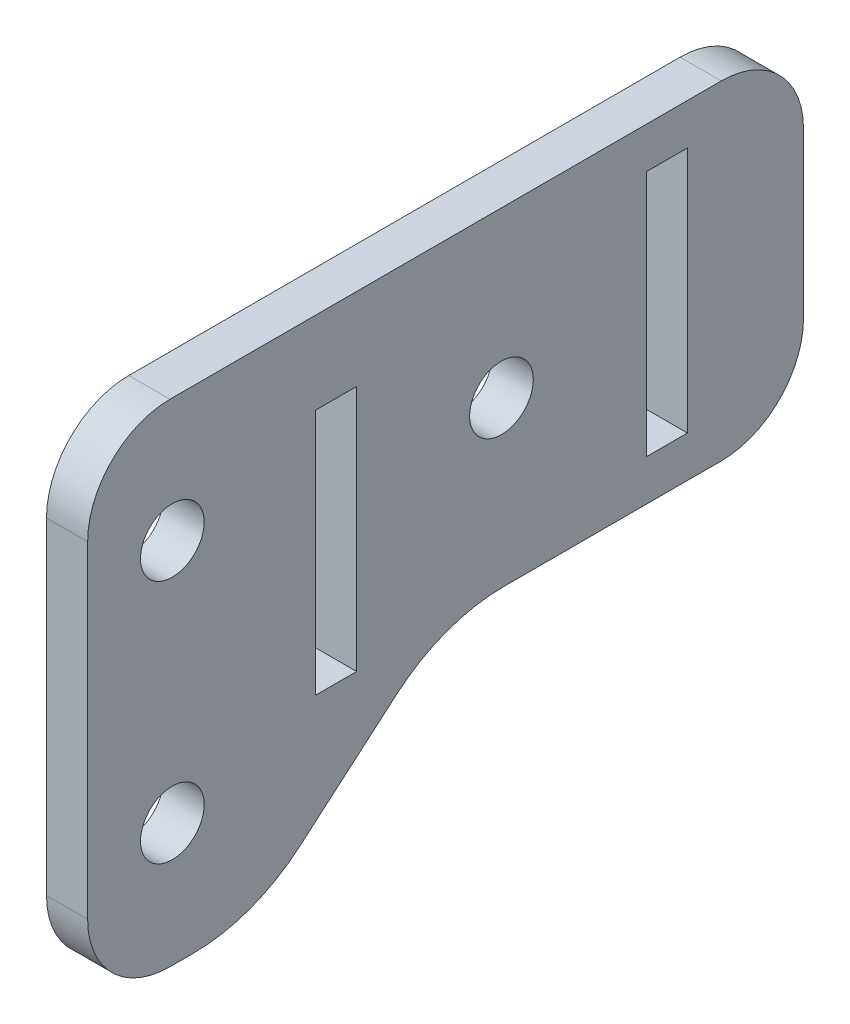
ISO-10303-21;
HEADER;
FILE_DESCRIPTION(('STEP AP214'),'2;1');
FILE_NAME('part.step','',(''),(''),'','','');
FILE_SCHEMA(('AUTOMOTIVE_DESIGN { 1 0 10303 214 1 1 1 1 }'));
ENDSEC;
DATA;
#1=APPLICATION_CONTEXT('core data for automotive mechanical design processes');
#2=APPLICATION_PROTOCOL_DEFINITION('international standard','automotive_design',2000,#1);
#3=PRODUCT_CONTEXT('',#1,'mechanical');
#4=PRODUCT('Part','Part','',(#3));
#5=PRODUCT_RELATED_PRODUCT_CATEGORY('part','',(#4));
#6=PRODUCT_DEFINITION_FORMATION('','',#4);
#7=PRODUCT_DEFINITION_CONTEXT('part definition',#1,'design');
#8=PRODUCT_DEFINITION('design','',#6,#7);
#9=PRODUCT_DEFINITION_SHAPE('','',#8);
#10=(LENGTH_UNIT() NAMED_UNIT(*) SI_UNIT(.MILLI.,.METRE.));
#11=(NAMED_UNIT(*) PLANE_ANGLE_UNIT() SI_UNIT($,.RADIAN.));
#12=(NAMED_UNIT(*) SI_UNIT($,.STERADIAN.) SOLID_ANGLE_UNIT());
#13=UNCERTAINTY_MEASURE_WITH_UNIT(LENGTH_MEASURE(1.E-05),#10,'distance_accuracy_value','');
#14=(GEOMETRIC_REPRESENTATION_CONTEXT(3) GLOBAL_UNCERTAINTY_ASSIGNED_CONTEXT((#13)) GLOBAL_UNIT_ASSIGNED_CONTEXT((#10,
#11,#12)) REPRESENTATION_CONTEXT('',''));
#15=CARTESIAN_POINT('',(0.,0.,0.));
#16=DIRECTION('',(0.,0.,1.));
#17=DIRECTION('',(1.,0.,0.));
#18=AXIS2_PLACEMENT_3D('',#15,#16,#17);
#19=CARTESIAN_POINT('',(3.175,17.2156788351446,31.9348602919418));
#20=DIRECTION('',(0.,0.,-1.));
#21=DIRECTION('',(0.,1.,0.));
#22=AXIS2_PLACEMENT_3D('',#19,#20,#21);
#23=PLANE('',#22);
#24=DIRECTION('',(0.,-1.,0.));
#25=VECTOR('',#24,1.);
#26=CARTESIAN_POINT('',(0.,17.2156788351446,31.9348602919418));
#27=LINE('',#26,#25);
#28=CARTESIAN_POINT('',(0.,10.8656788351446,31.9348602919418));
#29=VERTEX_POINT('',#28);
#30=CARTESIAN_POINT('',(0.,-14.3666811648554,31.9348602919418));
#31=VERTEX_POINT('',#30);
#32=EDGE_CURVE('E220',#29,#31,#27,.T.);
#33=ORIENTED_EDGE('',*,*,#32,.T.);
#34=DIRECTION('',(-1.,0.,0.));
#35=VECTOR('',#34,1.);
#36=CARTESIAN_POINT('',(3.175,-14.3666811648554,31.9348602919418));
#37=LINE('',#36,#35);
#38=CARTESIAN_POINT('',(3.175,-14.3666811648554,31.9348602919418));
#39=VERTEX_POINT('',#38);
#40=EDGE_CURVE('E11',#31,#39,#37,.F.);
#41=ORIENTED_EDGE('',*,*,#40,.T.);
#42=DIRECTION('',(0.,-1.,0.));
#43=VECTOR('',#42,1.);
#44=CARTESIAN_POINT('',(3.175,17.2156788351446,31.9348602919418));
#45=LINE('',#44,#43);
#46=CARTESIAN_POINT('',(3.175,10.8656788351446,31.9348602919418));
#47=VERTEX_POINT('',#46);
#48=EDGE_CURVE('E255',#47,#39,#45,.T.);
#49=ORIENTED_EDGE('',*,*,#48,.F.);
#50=DIRECTION('',(-1.,0.,0.));
#51=VECTOR('',#50,1.);
#52=CARTESIAN_POINT('',(3.175,10.8656788351446,31.9348602919418));
#53=LINE('',#52,#51);
#54=EDGE_CURVE('E45',#47,#29,#53,.T.);
#55=ORIENTED_EDGE('',*,*,#54,.T.);
#56=EDGE_LOOP('',(#33,#41,#49,#55));
#57=FACE_BOUND('',#56,.T.);
#58=ADVANCED_FACE('F37',(#57),#23,.F.);
#59=CARTESIAN_POINT('',(3.175,-20.7166811648554,23.8154632165909));
#60=DIRECTION('',(0.,1.,0.));
#61=DIRECTION('',(0.,0.,1.));
#62=AXIS2_PLACEMENT_3D('',#59,#60,#61);
#63=PLANE('',#62);
#64=DIRECTION('',(0.,0.,-1.));
#65=VECTOR('',#64,1.);
#66=CARTESIAN_POINT('',(3.175,-20.7166811648554,23.8154632165909));
#67=LINE('',#66,#65);
#68=CARTESIAN_POINT('',(3.175,-20.7166811648554,25.5848602919418));
#69=VERTEX_POINT('',#68);
#70=CARTESIAN_POINT('',(3.175,-20.7166811648554,23.8154632165909));
#71=VERTEX_POINT('',#70);
#72=EDGE_CURVE('E257',#69,#71,#67,.T.);
#73=ORIENTED_EDGE('',*,*,#72,.F.);
#74=DIRECTION('',(-1.,0.,0.));
#75=VECTOR('',#74,1.);
#76=CARTESIAN_POINT('',(3.175,-20.7166811648554,25.5848602919418));
#77=LINE('',#76,#75);
#78=CARTESIAN_POINT('',(0.,-20.7166811648554,25.5848602919418));
#79=VERTEX_POINT('',#78);
#80=EDGE_CURVE('E329',#69,#79,#77,.T.);
#81=ORIENTED_EDGE('',*,*,#80,.T.);
#82=DIRECTION('',(0.,0.,-1.));
#83=VECTOR('',#82,1.);
#84=CARTESIAN_POINT('',(0.,-20.7166811648554,23.8154632165909));
#85=LINE('',#84,#83);
#86=CARTESIAN_POINT('',(0.,-20.7166811648554,23.8154632165909));
#87=VERTEX_POINT('',#86);
#88=EDGE_CURVE('E277',#79,#87,#85,.T.);
#89=ORIENTED_EDGE('',*,*,#88,.T.);
#90=DIRECTION('',(-1.,0.,0.));
#91=VECTOR('',#90,1.);
#92=CARTESIAN_POINT('',(3.175,-20.7166811648554,23.8154632165909));
#93=LINE('',#92,#91);
#94=EDGE_CURVE('E300',#71,#87,#93,.T.);
#95=ORIENTED_EDGE('',*,*,#94,.F.);
#96=EDGE_LOOP('',(#73,#81,#89,#95));
#97=FACE_BOUND('',#96,.T.);
#98=ADVANCED_FACE('F348',(#97),#63,.F.);
#99=CARTESIAN_POINT('',(3.175,-8.01668116485543,23.8154632165909));
#100=DIRECTION('',(-1.,0.,0.));
#101=DIRECTION('',(0.,0.,1.));
#102=AXIS2_PLACEMENT_3D('',#99,#100,#101);
#103=CYLINDRICAL_SURFACE('',#102,12.7);
#104=CARTESIAN_POINT('',(0.,-8.01668116485543,23.8154632165909));
#105=DIRECTION('',(1.,0.,0.));
#106=DIRECTION('',(0.,0.,-1.));
#107=AXIS2_PLACEMENT_3D('',#104,#105,#106);
#108=CIRCLE('',#107,12.7);
#109=CARTESIAN_POINT('',(0.,-17.6547424695242,15.5451685248978));
#110=VERTEX_POINT('',#109);
#111=EDGE_CURVE('E279',#87,#110,#108,.T.);
#112=ORIENTED_EDGE('',*,*,#111,.T.);
#113=DIRECTION('',(-1.,0.,0.));
#114=VECTOR('',#113,1.);
#115=CARTESIAN_POINT('',(3.175,-17.6547424695242,15.5451685248978));
#116=LINE('',#115,#114);
#117=CARTESIAN_POINT('',(3.175,-17.6547424695242,15.5451685248978));
#118=VERTEX_POINT('',#117);
#119=EDGE_CURVE('E297',#118,#110,#116,.T.);
#120=ORIENTED_EDGE('',*,*,#119,.F.);
#121=CARTESIAN_POINT('',(3.175,-8.01668116485543,23.8154632165909));
#122=DIRECTION('',(1.,0.,0.));
#123=DIRECTION('',(0.,0.,-1.));
#124=AXIS2_PLACEMENT_3D('',#121,#122,#123);
#125=CIRCLE('',#124,12.7);
#126=EDGE_CURVE('E260',#71,#118,#125,.T.);
#127=ORIENTED_EDGE('',*,*,#126,.F.);
#128=ORIENTED_EDGE('',*,*,#94,.T.);
#129=EDGE_LOOP('',(#112,#120,#127,#128));
#130=FACE_BOUND('',#129,.T.);
#131=ADVANCED_FACE('F355',(#130),#103,.T.);
#132=CARTESIAN_POINT('',(3.175,-11.2462598601867,8.07683147510241));
#133=DIRECTION('',(0.,0.758902464934545,0.651204306432529));
#134=DIRECTION('',(0.,-0.651204306432529,0.758902464934545));
#135=AXIS2_PLACEMENT_3D('',#132,#133,#134);
#136=PLANE('',#135);
#137=DIRECTION('',(0.,0.651204306432529,-0.758902464934545));
#138=VECTOR('',#137,1.);
#139=CARTESIAN_POINT('',(0.,-11.2462598601867,8.07683147510241));
#140=LINE('',#139,#138);
#141=CARTESIAN_POINT('',(0.,-11.2462598601867,8.07683147510241));
#142=VERTEX_POINT('',#141);
#143=EDGE_CURVE('E281',#110,#142,#140,.T.);
#144=ORIENTED_EDGE('',*,*,#143,.T.);
#145=DIRECTION('',(-1.,0.,0.));
#146=VECTOR('',#145,1.);
#147=CARTESIAN_POINT('',(3.175,-11.2462598601867,8.07683147510241));
#148=LINE('',#147,#146);
#149=CARTESIAN_POINT('',(3.175,-11.2462598601867,8.07683147510241));
#150=VERTEX_POINT('',#149);
#151=EDGE_CURVE('E294',#150,#142,#148,.T.);
#152=ORIENTED_EDGE('',*,*,#151,.F.);
#153=DIRECTION('',(0.,0.651204306432529,-0.758902464934545));
#154=VECTOR('',#153,1.);
#155=CARTESIAN_POINT('',(3.175,-11.2462598601867,8.07683147510241));
#156=LINE('',#155,#154);
#157=EDGE_CURVE('E262',#118,#150,#156,.T.);
#158=ORIENTED_EDGE('',*,*,#157,.F.);
#159=ORIENTED_EDGE('',*,*,#119,.T.);
#160=EDGE_LOOP('',(#144,#152,#158,#159));
#161=FACE_BOUND('',#160,.T.);
#162=ADVANCED_FACE('F358',(#161),#136,.F.);
#163=CARTESIAN_POINT('',(3.175,-20.8843211648554,-0.193463216590709));
#164=DIRECTION('',(-1.,0.,0.));
#165=DIRECTION('',(0.,0.,1.));
#166=AXIS2_PLACEMENT_3D('',#163,#164,#165);
#167=CYLINDRICAL_SURFACE('',#166,12.7);
#168=CARTESIAN_POINT('',(0.,-20.8843211648554,-0.193463216590709));
#169=DIRECTION('',(-1.,0.,0.));
#170=DIRECTION('',(0.,0.,-1.));
#171=AXIS2_PLACEMENT_3D('',#168,#169,#170);
#172=CIRCLE('',#171,12.7);
#173=CARTESIAN_POINT('',(0.,-8.18432116485543,-0.193463216590736));
#174=VERTEX_POINT('',#173);
#175=EDGE_CURVE('E283',#142,#174,#172,.T.);
#176=ORIENTED_EDGE('',*,*,#175,.T.);
#177=DIRECTION('',(-1.,0.,0.));
#178=VECTOR('',#177,1.);
#179=CARTESIAN_POINT('',(3.175,-8.18432116485543,-0.193463216590736));
#180=LINE('',#179,#178);
#181=CARTESIAN_POINT('',(3.175,-8.18432116485543,-0.193463216590736));
#182=VERTEX_POINT('',#181);
#183=EDGE_CURVE('E274',#182,#174,#180,.T.);
#184=ORIENTED_EDGE('',*,*,#183,.F.);
#185=CARTESIAN_POINT('',(3.175,-20.8843211648554,-0.193463216590709));
#186=DIRECTION('',(-1.,0.,0.));
#187=DIRECTION('',(0.,0.,-1.));
#188=AXIS2_PLACEMENT_3D('',#185,#186,#187);
#189=CIRCLE('',#188,12.7);
#190=EDGE_CURVE('E264',#150,#182,#189,.T.);
#191=ORIENTED_EDGE('',*,*,#190,.F.);
#192=ORIENTED_EDGE('',*,*,#151,.T.);
#193=EDGE_LOOP('',(#176,#184,#191,#192));
#194=FACE_BOUND('',#193,.T.);
#195=ADVANCED_FACE('F363',(#194),#167,.F.);
#196=CARTESIAN_POINT('',(3.175,-8.18432116485543,-23.3101397080582));
#197=DIRECTION('',(0.,1.,0.));
#198=DIRECTION('',(0.,0.,1.));
#199=AXIS2_PLACEMENT_3D('',#196,#197,#198);
#200=PLANE('',#199);
#201=DIRECTION('',(0.,0.,-1.));
#202=VECTOR('',#201,1.);
#203=CARTESIAN_POINT('',(0.,-8.18432116485543,-23.3101397080582));
#204=LINE('',#203,#202);
#205=CARTESIAN_POINT('',(0.,-8.18432116485543,-16.9601397080582));
#206=VERTEX_POINT('',#205);
#207=EDGE_CURVE('E285',#174,#206,#204,.T.);
#208=ORIENTED_EDGE('',*,*,#207,.T.);
#209=DIRECTION('',(-1.,0.,0.));
#210=VECTOR('',#209,1.);
#211=CARTESIAN_POINT('',(3.175,-8.18432116485543,-16.9601397080582));
#212=LINE('',#211,#210);
#213=CARTESIAN_POINT('',(3.175,-8.18432116485543,-16.9601397080582));
#214=VERTEX_POINT('',#213);
#215=EDGE_CURVE('E52',#206,#214,#212,.F.);
#216=ORIENTED_EDGE('',*,*,#215,.T.);
#217=DIRECTION('',(0.,0.,-1.));
#218=VECTOR('',#217,1.);
#219=CARTESIAN_POINT('',(3.175,-8.18432116485543,-23.3101397080582));
#220=LINE('',#219,#218);
#221=EDGE_CURVE('E266',#182,#214,#220,.T.);
#222=ORIENTED_EDGE('',*,*,#221,.F.);
#223=ORIENTED_EDGE('',*,*,#183,.T.);
#224=EDGE_LOOP('',(#208,#216,#222,#223));
#225=FACE_BOUND('',#224,.T.);
#226=ADVANCED_FACE('F544',(#225),#200,.F.);
#227=CARTESIAN_POINT('',(3.175,-8.18432116485543,-23.3101397080582));
#228=DIRECTION('',(0.,0.,1.));
#229=DIRECTION('',(1.,0.,0.));
#230=AXIS2_PLACEMENT_3D('',#227,#228,#229);
#231=PLANE('',#230);
#232=DIRECTION('',(0.,1.,0.));
#233=VECTOR('',#232,1.);
#234=CARTESIAN_POINT('',(0.,-8.18432116485543,-23.3101397080582));
#235=LINE('',#234,#233);
#236=CARTESIAN_POINT('',(0.,-1.83432116485543,-23.3101397080582));
#237=VERTEX_POINT('',#236);
#238=CARTESIAN_POINT('',(0.,10.8656788351446,-23.3101397080582));
#239=VERTEX_POINT('',#238);
#240=EDGE_CURVE('E287',#237,#239,#235,.T.);
#241=ORIENTED_EDGE('',*,*,#240,.T.);
#242=DIRECTION('',(-1.,0.,0.));
#243=VECTOR('',#242,1.);
#244=CARTESIAN_POINT('',(3.175,10.8656788351446,-23.3101397080582));
#245=LINE('',#244,#243);
#246=CARTESIAN_POINT('',(3.175,10.8656788351446,-23.3101397080582));
#247=VERTEX_POINT('',#246);
#248=EDGE_CURVE('E319',#239,#247,#245,.F.);
#249=ORIENTED_EDGE('',*,*,#248,.T.);
#250=DIRECTION('',(0.,1.,0.));
#251=VECTOR('',#250,1.);
#252=CARTESIAN_POINT('',(3.175,-8.18432116485543,-23.3101397080582));
#253=LINE('',#252,#251);
#254=CARTESIAN_POINT('',(3.175,-1.83432116485543,-23.3101397080582));
#255=VERTEX_POINT('',#254);
#256=EDGE_CURVE('E268',#255,#247,#253,.T.);
#257=ORIENTED_EDGE('',*,*,#256,.F.);
#258=DIRECTION('',(-1.,0.,0.));
#259=VECTOR('',#258,1.);
#260=CARTESIAN_POINT('',(3.175,-1.83432116485543,-23.3101397080582));
#261=LINE('',#260,#259);
#262=EDGE_CURVE('E316',#255,#237,#261,.T.);
#263=ORIENTED_EDGE('',*,*,#262,.T.);
#264=EDGE_LOOP('',(#241,#249,#257,#263));
#265=FACE_BOUND('',#264,.T.);
#266=ADVANCED_FACE('F371',(#265),#231,.F.);
#267=CARTESIAN_POINT('',(3.175,17.2156788351446,31.9348602919418));
#268=DIRECTION('',(0.,-1.,0.));
#269=DIRECTION('',(0.,0.,-1.));
#270=AXIS2_PLACEMENT_3D('',#267,#268,#269);
#271=PLANE('',#270);
#272=DIRECTION('',(0.,0.,1.));
#273=VECTOR('',#272,1.);
#274=CARTESIAN_POINT('',(3.175,17.2156788351446,31.9348602919418));
#275=LINE('',#274,#273);
#276=CARTESIAN_POINT('',(3.175,17.2156788351446,-16.9601397080582));
#277=VERTEX_POINT('',#276);
#278=CARTESIAN_POINT('',(3.175,17.2156788351446,25.5848602919418));
#279=VERTEX_POINT('',#278);
#280=EDGE_CURVE('E271',#277,#279,#275,.T.);
#281=ORIENTED_EDGE('',*,*,#280,.F.);
#282=DIRECTION('',(-1.,0.,0.));
#283=VECTOR('',#282,1.);
#284=CARTESIAN_POINT('',(3.175,17.2156788351446,-16.9601397080582));
#285=LINE('',#284,#283);
#286=CARTESIAN_POINT('',(0.,17.2156788351446,-16.9601397080582));
#287=VERTEX_POINT('',#286);
#288=EDGE_CURVE('E305',#277,#287,#285,.T.);
#289=ORIENTED_EDGE('',*,*,#288,.T.);
#290=DIRECTION('',(0.,0.,1.));
#291=VECTOR('',#290,1.);
#292=CARTESIAN_POINT('',(0.,17.2156788351446,31.9348602919418));
#293=LINE('',#292,#291);
#294=CARTESIAN_POINT('',(0.,17.2156788351446,25.5848602919418));
#295=VERTEX_POINT('',#294);
#296=EDGE_CURVE('E258',#287,#295,#293,.T.);
#297=ORIENTED_EDGE('',*,*,#296,.T.);
#298=DIRECTION('',(-1.,0.,0.));
#299=VECTOR('',#298,1.);
#300=CARTESIAN_POINT('',(3.175,17.2156788351446,25.5848602919418));
#301=LINE('',#300,#299);
#302=EDGE_CURVE('E303',#295,#279,#301,.F.);
#303=ORIENTED_EDGE('',*,*,#302,.T.);
#304=EDGE_LOOP('',(#281,#289,#297,#303));
#305=FACE_BOUND('',#304,.T.);
#306=ADVANCED_FACE('F380',(#305),#271,.F.);
#307=CARTESIAN_POINT('',(3.175,-8.01668116485543,23.8154632165909));
#308=DIRECTION('',(1.,0.,0.));
#309=DIRECTION('',(0.,0.,-1.));
#310=AXIS2_PLACEMENT_3D('',#307,#308,#309);
#311=PLANE('',#310);
#312=CARTESIAN_POINT('',(3.175,7.69067883514458,25.4));
#313=DIRECTION('',(1.,0.,0.));
#314=DIRECTION('',(0.,0.,-1.));
#315=AXIS2_PLACEMENT_3D('',#312,#313,#314);
#316=CIRCLE('',#315,2.45744999999999);
#317=CARTESIAN_POINT('',(3.175,7.69067883514458,22.94255));
#318=VERTEX_POINT('',#317);
#319=EDGE_CURVE('E604',#318,#318,#316,.T.);
#320=ORIENTED_EDGE('',*,*,#319,.F.);
#321=EDGE_LOOP('',(#320));
#322=FACE_BOUND('',#321,.T.);
#323=CARTESIAN_POINT('',(3.175,-11.1916811648554,25.4));
#324=DIRECTION('',(1.,0.,0.));
#325=DIRECTION('',(0.,0.,-1.));
#326=AXIS2_PLACEMENT_3D('',#323,#324,#325);
#327=CIRCLE('',#326,2.45744999999999);
#328=CARTESIAN_POINT('',(3.175,-11.1916811648554,22.94255));
#329=VERTEX_POINT('',#328);
#330=EDGE_CURVE('E608',#329,#329,#327,.T.);
#331=ORIENTED_EDGE('',*,*,#330,.F.);
#332=EDGE_LOOP('',(#331));
#333=FACE_BOUND('',#332,.T.);
#334=CARTESIAN_POINT('',(3.175,4.51567883514458,0.));
#335=DIRECTION('',(1.,0.,0.));
#336=DIRECTION('',(0.,0.,-1.));
#337=AXIS2_PLACEMENT_3D('',#334,#335,#336);
#338=CIRCLE('',#337,2.45744999999999);
#339=CARTESIAN_POINT('',(3.175,4.51567883514458,-2.45744999999999));
#340=VERTEX_POINT('',#339);
#341=EDGE_CURVE('E207',#340,#340,#338,.T.);
#342=ORIENTED_EDGE('',*,*,#341,.F.);
#343=EDGE_LOOP('',(#342));
#344=FACE_BOUND('',#343,.T.);
#345=DIRECTION('',(0.,1.,0.));
#346=VECTOR('',#345,1.);
#347=CARTESIAN_POINT('',(3.175,14.0406788351446,-11.176));
#348=LINE('',#347,#346);
#349=CARTESIAN_POINT('',(3.175,-5.00932116485543,-11.176));
#350=VERTEX_POINT('',#349);
#351=CARTESIAN_POINT('',(3.175,14.0406788351446,-11.176));
#352=VERTEX_POINT('',#351);
#353=EDGE_CURVE('E180',#350,#352,#348,.T.);
#354=ORIENTED_EDGE('',*,*,#353,.T.);
#355=DIRECTION('',(0.,0.,-1.));
#356=VECTOR('',#355,1.);
#357=CARTESIAN_POINT('',(3.175,14.0406788351446,-11.176));
#358=LINE('',#357,#356);
#359=CARTESIAN_POINT('',(3.175,14.0406788351446,-14.351));
#360=VERTEX_POINT('',#359);
#361=EDGE_CURVE('E192',#352,#360,#358,.T.);
#362=ORIENTED_EDGE('',*,*,#361,.T.);
#363=DIRECTION('',(0.,-1.,0.));
#364=VECTOR('',#363,1.);
#365=CARTESIAN_POINT('',(3.175,-5.00932116485543,-14.351));
#366=LINE('',#365,#364);
#367=CARTESIAN_POINT('',(3.175,-5.00932116485543,-14.351));
#368=VERTEX_POINT('',#367);
#369=EDGE_CURVE('E196',#360,#368,#366,.T.);
#370=ORIENTED_EDGE('',*,*,#369,.T.);
#371=DIRECTION('',(0.,0.,1.));
#372=VECTOR('',#371,1.);
#373=CARTESIAN_POINT('',(3.175,-5.00932116485543,-11.176));
#374=LINE('',#373,#372);
#375=EDGE_CURVE('E188',#368,#350,#374,.T.);
#376=ORIENTED_EDGE('',*,*,#375,.T.);
#377=EDGE_LOOP('',(#354,#362,#370,#376));
#378=FACE_BOUND('',#377,.T.);
#379=DIRECTION('',(0.,1.,0.));
#380=VECTOR('',#379,1.);
#381=CARTESIAN_POINT('',(3.175,-8.18432116485535,14.351));
#382=LINE('',#381,#380);
#383=CARTESIAN_POINT('',(3.175,-8.18432116485535,14.351));
#384=VERTEX_POINT('',#383);
#385=CARTESIAN_POINT('',(3.175,10.8656788351446,14.351));
#386=VERTEX_POINT('',#385);
#387=EDGE_CURVE('E224',#384,#386,#382,.T.);
#388=ORIENTED_EDGE('',*,*,#387,.T.);
#389=DIRECTION('',(0.,0.,-1.));
#390=VECTOR('',#389,1.);
#391=CARTESIAN_POINT('',(3.175,10.8656788351446,14.351));
#392=LINE('',#391,#390);
#393=CARTESIAN_POINT('',(3.175,10.8656788351446,11.176));
#394=VERTEX_POINT('',#393);
#395=EDGE_CURVE('E227',#386,#394,#392,.T.);
#396=ORIENTED_EDGE('',*,*,#395,.T.);
#397=DIRECTION('',(0.,-1.,0.));
#398=VECTOR('',#397,1.);
#399=CARTESIAN_POINT('',(3.175,10.8656788351446,11.176));
#400=LINE('',#399,#398);
#401=CARTESIAN_POINT('',(3.175,-8.18432116485535,11.176));
#402=VERTEX_POINT('',#401);
#403=EDGE_CURVE('E231',#394,#402,#400,.T.);
#404=ORIENTED_EDGE('',*,*,#403,.T.);
#405=DIRECTION('',(0.,0.,1.));
#406=VECTOR('',#405,1.);
#407=CARTESIAN_POINT('',(3.175,-8.18432116485535,11.176));
#408=LINE('',#407,#406);
#409=EDGE_CURVE('E234',#402,#384,#408,.T.);
#410=ORIENTED_EDGE('',*,*,#409,.T.);
#411=EDGE_LOOP('',(#388,#396,#404,#410));
#412=FACE_BOUND('',#411,.T.);
#413=ORIENTED_EDGE('',*,*,#256,.T.);
#414=CARTESIAN_POINT('',(3.175,10.8656788351446,-16.9601397080582));
#415=DIRECTION('',(1.,0.,0.));
#416=DIRECTION('',(0.,0.,-1.));
#417=AXIS2_PLACEMENT_3D('',#414,#415,#416);
#418=CIRCLE('',#417,6.35);
#419=EDGE_CURVE('E326',#247,#277,#418,.T.);
#420=ORIENTED_EDGE('',*,*,#419,.T.);
#421=ORIENTED_EDGE('',*,*,#280,.T.);
#422=CARTESIAN_POINT('',(3.175,10.8656788351446,25.5848602919418));
#423=DIRECTION('',(1.,0.,0.));
#424=DIRECTION('',(0.,0.,-1.));
#425=AXIS2_PLACEMENT_3D('',#422,#423,#424);
#426=CIRCLE('',#425,6.35);
#427=EDGE_CURVE('E321',#279,#47,#426,.T.);
#428=ORIENTED_EDGE('',*,*,#427,.T.);
#429=ORIENTED_EDGE('',*,*,#48,.T.);
#430=CARTESIAN_POINT('',(3.175,-14.3666811648554,25.5848602919418));
#431=DIRECTION('',(1.,0.,0.));
#432=DIRECTION('',(0.,0.,-1.));
#433=AXIS2_PLACEMENT_3D('',#430,#431,#432);
#434=CIRCLE('',#433,6.35);
#435=EDGE_CURVE('E60',#39,#69,#434,.T.);
#436=ORIENTED_EDGE('',*,*,#435,.T.);
#437=ORIENTED_EDGE('',*,*,#72,.T.);
#438=ORIENTED_EDGE('',*,*,#126,.T.);
#439=ORIENTED_EDGE('',*,*,#157,.T.);
#440=ORIENTED_EDGE('',*,*,#190,.T.);
#441=ORIENTED_EDGE('',*,*,#221,.T.);
#442=CARTESIAN_POINT('',(3.175,-1.83432116485543,-16.9601397080582));
#443=DIRECTION('',(1.,0.,0.));
#444=DIRECTION('',(0.,0.,-1.));
#445=AXIS2_PLACEMENT_3D('',#442,#443,#444);
#446=CIRCLE('',#445,6.35);
#447=EDGE_CURVE('E324',#214,#255,#446,.T.);
#448=ORIENTED_EDGE('',*,*,#447,.T.);
#449=EDGE_LOOP('',(#413,#420,#421,#428,#429,#436,#437,#438,#439,#440,#441,#448));
#450=FACE_BOUND('',#449,.T.);
#451=ADVANCED_FACE('F198',(#322,#333,#344,#378,#412,#450),#311,.T.);
#452=CARTESIAN_POINT('',(0.,-8.01668116485543,23.8154632165909));
#453=DIRECTION('',(1.,0.,0.));
#454=DIRECTION('',(0.,0.,-1.));
#455=AXIS2_PLACEMENT_3D('',#452,#453,#454);
#456=PLANE('',#455);
#457=CARTESIAN_POINT('',(0.,7.69067883514458,25.4));
#458=DIRECTION('',(-1.,0.,0.));
#459=DIRECTION('',(0.,0.,1.));
#460=AXIS2_PLACEMENT_3D('',#457,#458,#459);
#461=CIRCLE('',#460,2.45744999999999);
#462=CARTESIAN_POINT('',(0.,7.69067883514458,27.85745));
#463=VERTEX_POINT('',#462);
#464=EDGE_CURVE('E621',#463,#463,#461,.T.);
#465=ORIENTED_EDGE('',*,*,#464,.F.);
#466=EDGE_LOOP('',(#465));
#467=FACE_BOUND('',#466,.T.);
#468=CARTESIAN_POINT('',(0.,-11.1916811648554,25.4));
#469=DIRECTION('',(-1.,0.,0.));
#470=DIRECTION('',(0.,0.,1.));
#471=AXIS2_PLACEMENT_3D('',#468,#469,#470);
#472=CIRCLE('',#471,2.45744999999999);
#473=CARTESIAN_POINT('',(0.,-11.1916811648554,27.85745));
#474=VERTEX_POINT('',#473);
#475=EDGE_CURVE('E615',#474,#474,#472,.T.);
#476=ORIENTED_EDGE('',*,*,#475,.F.);
#477=EDGE_LOOP('',(#476));
#478=FACE_BOUND('',#477,.T.);
#479=CARTESIAN_POINT('',(0.,4.51567883514458,0.));
#480=DIRECTION('',(-1.,0.,0.));
#481=DIRECTION('',(0.,0.,1.));
#482=AXIS2_PLACEMENT_3D('',#479,#480,#481);
#483=CIRCLE('',#482,2.45744999999999);
#484=CARTESIAN_POINT('',(0.,4.51567883514458,2.45744999999999));
#485=VERTEX_POINT('',#484);
#486=EDGE_CURVE('E611',#485,#485,#483,.T.);
#487=ORIENTED_EDGE('',*,*,#486,.F.);
#488=EDGE_LOOP('',(#487));
#489=FACE_BOUND('',#488,.T.);
#490=DIRECTION('',(0.,0.,-1.));
#491=VECTOR('',#490,1.);
#492=CARTESIAN_POINT('',(0.,14.0406788351446,-11.176));
#493=LINE('',#492,#491);
#494=CARTESIAN_POINT('',(0.,14.0406788351446,-11.176));
#495=VERTEX_POINT('',#494);
#496=CARTESIAN_POINT('',(0.,14.0406788351446,-14.351));
#497=VERTEX_POINT('',#496);
#498=EDGE_CURVE('E213',#495,#497,#493,.T.);
#499=ORIENTED_EDGE('',*,*,#498,.F.);
#500=DIRECTION('',(0.,1.,0.));
#501=VECTOR('',#500,1.);
#502=CARTESIAN_POINT('',(0.,14.0406788351446,-11.176));
#503=LINE('',#502,#501);
#504=CARTESIAN_POINT('',(0.,-5.00932116485543,-11.176));
#505=VERTEX_POINT('',#504);
#506=EDGE_CURVE('E183',#505,#495,#503,.T.);
#507=ORIENTED_EDGE('',*,*,#506,.F.);
#508=DIRECTION('',(0.,0.,1.));
#509=VECTOR('',#508,1.);
#510=CARTESIAN_POINT('',(0.,-5.00932116485543,-11.176));
#511=LINE('',#510,#509);
#512=CARTESIAN_POINT('',(0.,-5.00932116485543,-14.351));
#513=VERTEX_POINT('',#512);
#514=EDGE_CURVE('E201',#513,#505,#511,.T.);
#515=ORIENTED_EDGE('',*,*,#514,.F.);
#516=DIRECTION('',(0.,-1.,0.));
#517=VECTOR('',#516,1.);
#518=CARTESIAN_POINT('',(0.,-5.00932116485543,-14.351));
#519=LINE('',#518,#517);
#520=EDGE_CURVE('E204',#497,#513,#519,.T.);
#521=ORIENTED_EDGE('',*,*,#520,.F.);
#522=EDGE_LOOP('',(#499,#507,#515,#521));
#523=FACE_BOUND('',#522,.T.);
#524=DIRECTION('',(0.,0.,-1.));
#525=VECTOR('',#524,1.);
#526=CARTESIAN_POINT('',(0.,10.8656788351446,14.351));
#527=LINE('',#526,#525);
#528=CARTESIAN_POINT('',(0.,10.8656788351446,14.351));
#529=VERTEX_POINT('',#528);
#530=CARTESIAN_POINT('',(0.,10.8656788351446,11.176));
#531=VERTEX_POINT('',#530);
#532=EDGE_CURVE('E240',#529,#531,#527,.T.);
#533=ORIENTED_EDGE('',*,*,#532,.F.);
#534=DIRECTION('',(0.,1.,0.));
#535=VECTOR('',#534,1.);
#536=CARTESIAN_POINT('',(0.,-8.18432116485535,14.351));
#537=LINE('',#536,#535);
#538=CARTESIAN_POINT('',(0.,-8.18432116485535,14.351));
#539=VERTEX_POINT('',#538);
#540=EDGE_CURVE('E238',#539,#529,#537,.T.);
#541=ORIENTED_EDGE('',*,*,#540,.F.);
#542=DIRECTION('',(0.,0.,1.));
#543=VECTOR('',#542,1.);
#544=CARTESIAN_POINT('',(0.,-8.18432116485535,11.176));
#545=LINE('',#544,#543);
#546=CARTESIAN_POINT('',(0.,-8.18432116485535,11.176));
#547=VERTEX_POINT('',#546);
#548=EDGE_CURVE('E228',#547,#539,#545,.T.);
#549=ORIENTED_EDGE('',*,*,#548,.F.);
#550=DIRECTION('',(0.,-1.,0.));
#551=VECTOR('',#550,1.);
#552=CARTESIAN_POINT('',(0.,10.8656788351446,11.176));
#553=LINE('',#552,#551);
#554=EDGE_CURVE('E243',#531,#547,#553,.T.);
#555=ORIENTED_EDGE('',*,*,#554,.F.);
#556=EDGE_LOOP('',(#533,#541,#549,#555));
#557=FACE_BOUND('',#556,.T.);
#558=ORIENTED_EDGE('',*,*,#296,.F.);
#559=CARTESIAN_POINT('',(0.,10.8656788351446,-16.9601397080582));
#560=DIRECTION('',(1.,0.,0.));
#561=DIRECTION('',(0.,0.,-1.));
#562=AXIS2_PLACEMENT_3D('',#559,#560,#561);
#563=CIRCLE('',#562,6.35);
#564=EDGE_CURVE('E314',#287,#239,#563,.F.);
#565=ORIENTED_EDGE('',*,*,#564,.T.);
#566=ORIENTED_EDGE('',*,*,#240,.F.);
#567=CARTESIAN_POINT('',(0.,-1.83432116485543,-16.9601397080582));
#568=DIRECTION('',(1.,0.,0.));
#569=DIRECTION('',(0.,0.,-1.));
#570=AXIS2_PLACEMENT_3D('',#567,#568,#569);
#571=CIRCLE('',#570,6.35);
#572=EDGE_CURVE('E312',#237,#206,#571,.F.);
#573=ORIENTED_EDGE('',*,*,#572,.T.);
#574=ORIENTED_EDGE('',*,*,#207,.F.);
#575=ORIENTED_EDGE('',*,*,#175,.F.);
#576=ORIENTED_EDGE('',*,*,#143,.F.);
#577=ORIENTED_EDGE('',*,*,#111,.F.);
#578=ORIENTED_EDGE('',*,*,#88,.F.);
#579=CARTESIAN_POINT('',(0.,-14.3666811648554,25.5848602919418));
#580=DIRECTION('',(1.,0.,0.));
#581=DIRECTION('',(0.,0.,-1.));
#582=AXIS2_PLACEMENT_3D('',#579,#580,#581);
#583=CIRCLE('',#582,6.35);
#584=EDGE_CURVE('E310',#79,#31,#583,.F.);
#585=ORIENTED_EDGE('',*,*,#584,.T.);
#586=ORIENTED_EDGE('',*,*,#32,.F.);
#587=CARTESIAN_POINT('',(0.,10.8656788351446,25.5848602919418));
#588=DIRECTION('',(1.,0.,0.));
#589=DIRECTION('',(0.,0.,-1.));
#590=AXIS2_PLACEMENT_3D('',#587,#588,#589);
#591=CIRCLE('',#590,6.35);
#592=EDGE_CURVE('E308',#29,#295,#591,.F.);
#593=ORIENTED_EDGE('',*,*,#592,.T.);
#594=EDGE_LOOP('',(#558,#565,#566,#573,#574,#575,#576,#577,#578,#585,#586,#593));
#595=FACE_BOUND('',#594,.T.);
#596=ADVANCED_FACE('F341',(#467,#478,#489,#523,#557,#595),#456,.F.);
#597=CARTESIAN_POINT('',(3.175,-8.18432116485535,14.351));
#598=DIRECTION('',(0.,0.,1.));
#599=DIRECTION('',(0.,-1.,0.));
#600=AXIS2_PLACEMENT_3D('',#597,#598,#599);
#601=PLANE('',#600);
#602=ORIENTED_EDGE('',*,*,#540,.T.);
#603=DIRECTION('',(-1.,0.,0.));
#604=VECTOR('',#603,1.);
#605=CARTESIAN_POINT('',(3.175,10.8656788351446,14.351));
#606=LINE('',#605,#604);
#607=EDGE_CURVE('E237',#386,#529,#606,.T.);
#608=ORIENTED_EDGE('',*,*,#607,.F.);
#609=ORIENTED_EDGE('',*,*,#387,.F.);
#610=DIRECTION('',(-1.,0.,0.));
#611=VECTOR('',#610,1.);
#612=CARTESIAN_POINT('',(3.175,-8.18432116485535,14.351));
#613=LINE('',#612,#611);
#614=EDGE_CURVE('E214',#384,#539,#613,.T.);
#615=ORIENTED_EDGE('',*,*,#614,.T.);
#616=EDGE_LOOP('',(#602,#608,#609,#615));
#617=FACE_BOUND('',#616,.T.);
#618=ADVANCED_FACE('F504',(#617),#601,.F.);
#619=CARTESIAN_POINT('',(3.175,-8.18432116485535,11.176));
#620=DIRECTION('',(0.,-1.,0.));
#621=DIRECTION('',(0.,0.,-1.));
#622=AXIS2_PLACEMENT_3D('',#619,#620,#621);
#623=PLANE('',#622);
#624=ORIENTED_EDGE('',*,*,#548,.T.);
#625=ORIENTED_EDGE('',*,*,#614,.F.);
#626=ORIENTED_EDGE('',*,*,#409,.F.);
#627=DIRECTION('',(-1.,0.,0.));
#628=VECTOR('',#627,1.);
#629=CARTESIAN_POINT('',(3.175,-8.18432116485535,11.176));
#630=LINE('',#629,#628);
#631=EDGE_CURVE('E249',#402,#547,#630,.T.);
#632=ORIENTED_EDGE('',*,*,#631,.T.);
#633=EDGE_LOOP('',(#624,#625,#626,#632));
#634=FACE_BOUND('',#633,.T.);
#635=ADVANCED_FACE('F495',(#634),#623,.F.);
#636=CARTESIAN_POINT('',(3.175,10.8656788351446,11.176));
#637=DIRECTION('',(0.,0.,-1.));
#638=DIRECTION('',(0.,1.,0.));
#639=AXIS2_PLACEMENT_3D('',#636,#637,#638);
#640=PLANE('',#639);
#641=ORIENTED_EDGE('',*,*,#554,.T.);
#642=ORIENTED_EDGE('',*,*,#631,.F.);
#643=ORIENTED_EDGE('',*,*,#403,.F.);
#644=DIRECTION('',(-1.,0.,0.));
#645=VECTOR('',#644,1.);
#646=CARTESIAN_POINT('',(3.175,10.8656788351446,11.176));
#647=LINE('',#646,#645);
#648=EDGE_CURVE('E251',#394,#531,#647,.T.);
#649=ORIENTED_EDGE('',*,*,#648,.T.);
#650=EDGE_LOOP('',(#641,#642,#643,#649));
#651=FACE_BOUND('',#650,.T.);
#652=ADVANCED_FACE('F486',(#651),#640,.F.);
#653=CARTESIAN_POINT('',(3.175,10.8656788351446,14.351));
#654=DIRECTION('',(0.,1.,0.));
#655=DIRECTION('',(0.,0.,1.));
#656=AXIS2_PLACEMENT_3D('',#653,#654,#655);
#657=PLANE('',#656);
#658=ORIENTED_EDGE('',*,*,#532,.T.);
#659=ORIENTED_EDGE('',*,*,#648,.F.);
#660=ORIENTED_EDGE('',*,*,#395,.F.);
#661=ORIENTED_EDGE('',*,*,#607,.T.);
#662=EDGE_LOOP('',(#658,#659,#660,#661));
#663=FACE_BOUND('',#662,.T.);
#664=ADVANCED_FACE('F478',(#663),#657,.F.);
#665=CARTESIAN_POINT('',(3.175,14.0406788351446,-11.176));
#666=DIRECTION('',(0.,0.,1.));
#667=DIRECTION('',(0.,-1.,0.));
#668=AXIS2_PLACEMENT_3D('',#665,#666,#667);
#669=PLANE('',#668);
#670=ORIENTED_EDGE('',*,*,#506,.T.);
#671=DIRECTION('',(-1.,0.,0.));
#672=VECTOR('',#671,1.);
#673=CARTESIAN_POINT('',(3.175,14.0406788351446,-11.176));
#674=LINE('',#673,#672);
#675=EDGE_CURVE('E176',#352,#495,#674,.T.);
#676=ORIENTED_EDGE('',*,*,#675,.F.);
#677=ORIENTED_EDGE('',*,*,#353,.F.);
#678=DIRECTION('',(-1.,0.,0.));
#679=VECTOR('',#678,1.);
#680=CARTESIAN_POINT('',(3.175,-5.00932116485543,-11.176));
#681=LINE('',#680,#679);
#682=EDGE_CURVE('E218',#350,#505,#681,.T.);
#683=ORIENTED_EDGE('',*,*,#682,.T.);
#684=EDGE_LOOP('',(#670,#676,#677,#683));
#685=FACE_BOUND('',#684,.T.);
#686=ADVANCED_FACE('F178',(#685),#669,.F.);
#687=CARTESIAN_POINT('',(3.175,-5.00932116485543,-11.176));
#688=DIRECTION('',(0.,-1.,0.));
#689=DIRECTION('',(0.,0.,-1.));
#690=AXIS2_PLACEMENT_3D('',#687,#688,#689);
#691=PLANE('',#690);
#692=ORIENTED_EDGE('',*,*,#514,.T.);
#693=ORIENTED_EDGE('',*,*,#682,.F.);
#694=ORIENTED_EDGE('',*,*,#375,.F.);
#695=DIRECTION('',(-1.,0.,0.));
#696=VECTOR('',#695,1.);
#697=CARTESIAN_POINT('',(3.175,-5.00932116485543,-14.351));
#698=LINE('',#697,#696);
#699=EDGE_CURVE('E221',#368,#513,#698,.T.);
#700=ORIENTED_EDGE('',*,*,#699,.T.);
#701=EDGE_LOOP('',(#692,#693,#694,#700));
#702=FACE_BOUND('',#701,.T.);
#703=ADVANCED_FACE('F461',(#702),#691,.F.);
#704=CARTESIAN_POINT('',(3.175,-5.00932116485543,-14.351));
#705=DIRECTION('',(0.,0.,-1.));
#706=DIRECTION('',(-1.,0.,0.));
#707=AXIS2_PLACEMENT_3D('',#704,#705,#706);
#708=PLANE('',#707);
#709=ORIENTED_EDGE('',*,*,#520,.T.);
#710=ORIENTED_EDGE('',*,*,#699,.F.);
#711=ORIENTED_EDGE('',*,*,#369,.F.);
#712=DIRECTION('',(-1.,0.,0.));
#713=VECTOR('',#712,1.);
#714=CARTESIAN_POINT('',(3.175,14.0406788351446,-14.351));
#715=LINE('',#714,#713);
#716=EDGE_CURVE('E187',#360,#497,#715,.T.);
#717=ORIENTED_EDGE('',*,*,#716,.T.);
#718=EDGE_LOOP('',(#709,#710,#711,#717));
#719=FACE_BOUND('',#718,.T.);
#720=ADVANCED_FACE('F453',(#719),#708,.F.);
#721=CARTESIAN_POINT('',(3.175,14.0406788351446,-11.176));
#722=DIRECTION('',(0.,1.,0.));
#723=DIRECTION('',(0.,0.,1.));
#724=AXIS2_PLACEMENT_3D('',#721,#722,#723);
#725=PLANE('',#724);
#726=ORIENTED_EDGE('',*,*,#498,.T.);
#727=ORIENTED_EDGE('',*,*,#716,.F.);
#728=ORIENTED_EDGE('',*,*,#361,.F.);
#729=ORIENTED_EDGE('',*,*,#675,.T.);
#730=EDGE_LOOP('',(#726,#727,#728,#729));
#731=FACE_BOUND('',#730,.T.);
#732=ADVANCED_FACE('F193',(#731),#725,.F.);
#733=CARTESIAN_POINT('',(0.,4.51567883514458,0.));
#734=DIRECTION('',(-1.,0.,0.));
#735=DIRECTION('',(0.,0.,1.));
#736=AXIS2_PLACEMENT_3D('',#733,#734,#735);
#737=CYLINDRICAL_SURFACE('',#736,2.45744999999999);
#738=ORIENTED_EDGE('',*,*,#341,.T.);
#739=EDGE_LOOP('',(#738));
#740=FACE_BOUND('',#739,.T.);
#741=ORIENTED_EDGE('',*,*,#486,.T.);
#742=EDGE_LOOP('',(#741));
#743=FACE_BOUND('',#742,.T.);
#744=ADVANCED_FACE('F436',(#740,#743),#737,.F.);
#745=CARTESIAN_POINT('',(0.,-11.1916811648554,25.4));
#746=DIRECTION('',(-1.,0.,0.));
#747=DIRECTION('',(0.,0.,1.));
#748=AXIS2_PLACEMENT_3D('',#745,#746,#747);
#749=CYLINDRICAL_SURFACE('',#748,2.45744999999999);
#750=ORIENTED_EDGE('',*,*,#330,.T.);
#751=EDGE_LOOP('',(#750));
#752=FACE_BOUND('',#751,.T.);
#753=ORIENTED_EDGE('',*,*,#475,.T.);
#754=EDGE_LOOP('',(#753));
#755=FACE_BOUND('',#754,.T.);
#756=ADVANCED_FACE('F427',(#752,#755),#749,.F.);
#757=CARTESIAN_POINT('',(0.,7.69067883514458,25.4));
#758=DIRECTION('',(-1.,0.,0.));
#759=DIRECTION('',(0.,0.,1.));
#760=AXIS2_PLACEMENT_3D('',#757,#758,#759);
#761=CYLINDRICAL_SURFACE('',#760,2.45744999999999);
#762=ORIENTED_EDGE('',*,*,#319,.T.);
#763=EDGE_LOOP('',(#762));
#764=FACE_BOUND('',#763,.T.);
#765=ORIENTED_EDGE('',*,*,#464,.T.);
#766=EDGE_LOOP('',(#765));
#767=FACE_BOUND('',#766,.T.);
#768=ADVANCED_FACE('F396',(#764,#767),#761,.F.);
#769=CARTESIAN_POINT('',(3.175,10.8656788351446,-16.9601397080582));
#770=DIRECTION('',(-1.,0.,0.));
#771=DIRECTION('',(0.,0.,1.));
#772=AXIS2_PLACEMENT_3D('',#769,#770,#771);
#773=CYLINDRICAL_SURFACE('',#772,6.35);
#774=ORIENTED_EDGE('',*,*,#419,.F.);
#775=ORIENTED_EDGE('',*,*,#248,.F.);
#776=ORIENTED_EDGE('',*,*,#564,.F.);
#777=ORIENTED_EDGE('',*,*,#288,.F.);
#778=EDGE_LOOP('',(#774,#775,#776,#777));
#779=FACE_BOUND('',#778,.T.);
#780=ADVANCED_FACE('F377',(#779),#773,.T.);
#781=CARTESIAN_POINT('',(3.175,-1.83432116485543,-16.9601397080582));
#782=DIRECTION('',(-1.,0.,0.));
#783=DIRECTION('',(0.,0.,1.));
#784=AXIS2_PLACEMENT_3D('',#781,#782,#783);
#785=CYLINDRICAL_SURFACE('',#784,6.35);
#786=ORIENTED_EDGE('',*,*,#447,.F.);
#787=ORIENTED_EDGE('',*,*,#215,.F.);
#788=ORIENTED_EDGE('',*,*,#572,.F.);
#789=ORIENTED_EDGE('',*,*,#262,.F.);
#790=EDGE_LOOP('',(#786,#787,#788,#789));
#791=FACE_BOUND('',#790,.T.);
#792=ADVANCED_FACE('F368',(#791),#785,.T.);
#793=CARTESIAN_POINT('',(3.175,-14.3666811648554,25.5848602919418));
#794=DIRECTION('',(-1.,0.,0.));
#795=DIRECTION('',(0.,0.,1.));
#796=AXIS2_PLACEMENT_3D('',#793,#794,#795);
#797=CYLINDRICAL_SURFACE('',#796,6.35);
#798=ORIENTED_EDGE('',*,*,#435,.F.);
#799=ORIENTED_EDGE('',*,*,#40,.F.);
#800=ORIENTED_EDGE('',*,*,#584,.F.);
#801=ORIENTED_EDGE('',*,*,#80,.F.);
#802=EDGE_LOOP('',(#798,#799,#800,#801));
#803=FACE_BOUND('',#802,.T.);
#804=ADVANCED_FACE('F346',(#803),#797,.T.);
#805=CARTESIAN_POINT('',(3.175,10.8656788351446,25.5848602919418));
#806=DIRECTION('',(-1.,0.,0.));
#807=DIRECTION('',(0.,0.,1.));
#808=AXIS2_PLACEMENT_3D('',#805,#806,#807);
#809=CYLINDRICAL_SURFACE('',#808,6.35);
#810=ORIENTED_EDGE('',*,*,#427,.F.);
#811=ORIENTED_EDGE('',*,*,#302,.F.);
#812=ORIENTED_EDGE('',*,*,#592,.F.);
#813=ORIENTED_EDGE('',*,*,#54,.F.);
#814=EDGE_LOOP('',(#810,#811,#812,#813));
#815=FACE_BOUND('',#814,.T.);
#816=ADVANCED_FACE('F39',(#815),#809,.T.);
#817=CLOSED_SHELL('',(#58,#98,#131,#162,#195,#226,#266,#306,#451,#596,#618,#635,#652,#664,#686,
#703,#720,#732,#744,#756,#768,#780,#792,#804,#816));
#818=MANIFOLD_SOLID_BREP('B2',#817);
#819=ADVANCED_BREP_SHAPE_REPRESENTATION('',(#18,#818),#14);
#820=SHAPE_DEFINITION_REPRESENTATION(#9,#819);
ENDSEC;
END-ISO-10303-21;
